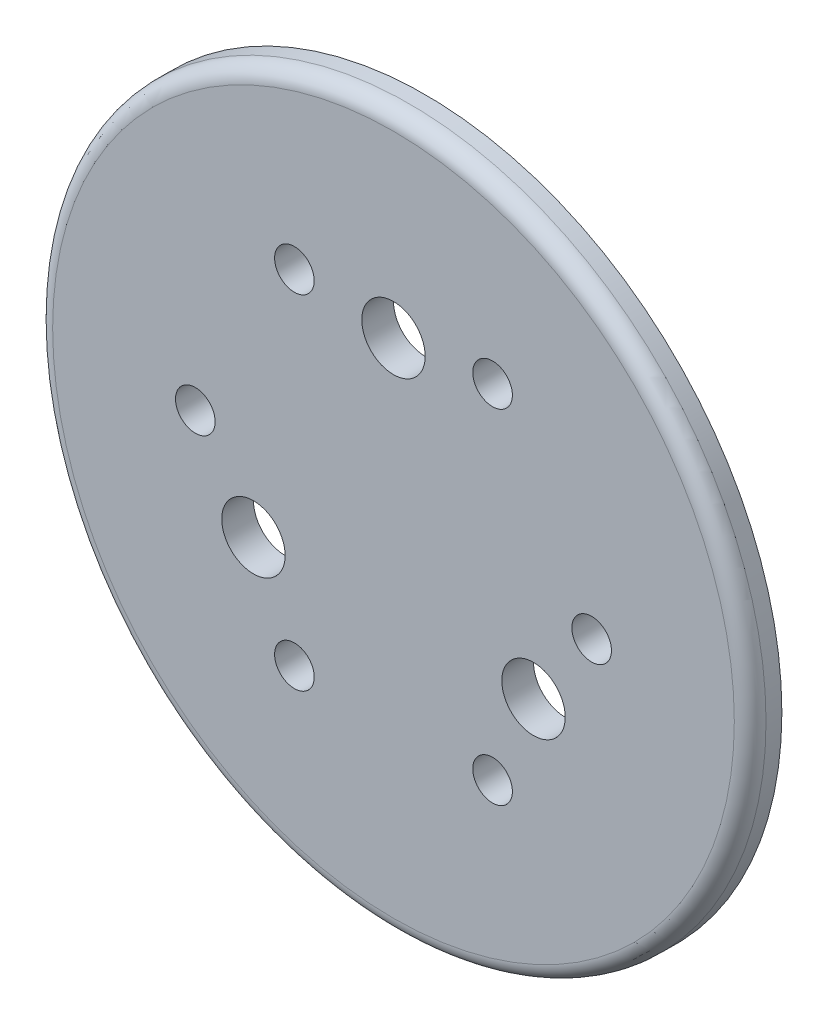
ISO-10303-21;
HEADER;
FILE_DESCRIPTION(('STEP AP214'),'2;1');
FILE_NAME('part.step','',(''),(''),'','','');
FILE_SCHEMA(('AUTOMOTIVE_DESIGN { 1 0 10303 214 1 1 1 1 }'));
ENDSEC;
DATA;
#1=APPLICATION_CONTEXT('core data for automotive mechanical design processes');
#2=APPLICATION_PROTOCOL_DEFINITION('international standard','automotive_design',2000,#1);
#3=PRODUCT_CONTEXT('',#1,'mechanical');
#4=PRODUCT('Part','Part','',(#3));
#5=PRODUCT_RELATED_PRODUCT_CATEGORY('part','',(#4));
#6=PRODUCT_DEFINITION_FORMATION('','',#4);
#7=PRODUCT_DEFINITION_CONTEXT('part definition',#1,'design');
#8=PRODUCT_DEFINITION('design','',#6,#7);
#9=PRODUCT_DEFINITION_SHAPE('','',#8);
#10=(LENGTH_UNIT() NAMED_UNIT(*) SI_UNIT(.MILLI.,.METRE.));
#11=(NAMED_UNIT(*) PLANE_ANGLE_UNIT() SI_UNIT($,.RADIAN.));
#12=(NAMED_UNIT(*) SI_UNIT($,.STERADIAN.) SOLID_ANGLE_UNIT());
#13=UNCERTAINTY_MEASURE_WITH_UNIT(LENGTH_MEASURE(1.E-05),#10,'distance_accuracy_value','');
#14=(GEOMETRIC_REPRESENTATION_CONTEXT(3) GLOBAL_UNCERTAINTY_ASSIGNED_CONTEXT((#13)) GLOBAL_UNIT_ASSIGNED_CONTEXT((#10,
#11,#12)) REPRESENTATION_CONTEXT('',''));
#15=CARTESIAN_POINT('',(0.,0.,0.));
#16=DIRECTION('',(0.,0.,1.));
#17=DIRECTION('',(1.,0.,0.));
#18=AXIS2_PLACEMENT_3D('',#15,#16,#17);
#19=CARTESIAN_POINT('',(0.,0.,-2.));
#20=DIRECTION('',(0.,0.,-1.));
#21=DIRECTION('',(1.,0.,0.));
#22=AXIS2_PLACEMENT_3D('',#19,#20,#21);
#23=PLANE('',#22);
#24=CARTESIAN_POINT('',(-8.83345911860132,-5.09999999999992,-2.));
#25=DIRECTION('',(0.,0.,1.));
#26=DIRECTION('',(1.,0.,0.));
#27=AXIS2_PLACEMENT_3D('',#24,#25,#26);
#28=CIRCLE('',#27,2.);
#29=CARTESIAN_POINT('',(-6.83345911860132,-5.09999999999992,-2.));
#30=VERTEX_POINT('',#29);
#31=EDGE_CURVE('E96',#30,#30,#28,.T.);
#32=ORIENTED_EDGE('',*,*,#31,.T.);
#33=EDGE_LOOP('',(#32));
#34=FACE_BOUND('',#33,.T.);
#35=CARTESIAN_POINT('',(-6.2500000000001,-10.8253175473054,-2.));
#36=DIRECTION('',(0.,0.,1.));
#37=DIRECTION('',(1.,0.,0.));
#38=AXIS2_PLACEMENT_3D('',#35,#36,#37);
#39=CIRCLE('',#38,1.25);
#40=CARTESIAN_POINT('',(-5.0000000000001,-10.8253175473054,-2.));
#41=VERTEX_POINT('',#40);
#42=EDGE_CURVE('E84',#41,#41,#39,.T.);
#43=ORIENTED_EDGE('',*,*,#42,.T.);
#44=EDGE_LOOP('',(#43));
#45=FACE_BOUND('',#44,.T.);
#46=CARTESIAN_POINT('',(12.5,0.,-2.));
#47=DIRECTION('',(0.,0.,1.));
#48=DIRECTION('',(1.,0.,0.));
#49=AXIS2_PLACEMENT_3D('',#46,#47,#48);
#50=CIRCLE('',#49,1.25);
#51=CARTESIAN_POINT('',(13.75,0.,-2.));
#52=VERTEX_POINT('',#51);
#53=EDGE_CURVE('E72',#52,#52,#50,.T.);
#54=ORIENTED_EDGE('',*,*,#53,.T.);
#55=EDGE_LOOP('',(#54));
#56=FACE_BOUND('',#55,.T.);
#57=CARTESIAN_POINT('',(-6.25000000000002,10.8253175473055,-2.));
#58=DIRECTION('',(0.,0.,1.));
#59=DIRECTION('',(1.,0.,0.));
#60=AXIS2_PLACEMENT_3D('',#57,#58,#59);
#61=CIRCLE('',#60,1.25);
#62=CARTESIAN_POINT('',(-5.00000000000002,10.8253175473055,-2.));
#63=VERTEX_POINT('',#62);
#64=EDGE_CURVE('E60',#63,#63,#61,.T.);
#65=ORIENTED_EDGE('',*,*,#64,.T.);
#66=EDGE_LOOP('',(#65));
#67=FACE_BOUND('',#66,.T.);
#68=CARTESIAN_POINT('',(0.,0.,-2.));
#69=DIRECTION('',(0.,0.,1.));
#70=DIRECTION('',(1.,0.,0.));
#71=AXIS2_PLACEMENT_3D('',#68,#69,#70);
#72=CIRCLE('',#71,22.5);
#73=CARTESIAN_POINT('',(22.5,0.,-2.));
#74=VERTEX_POINT('',#73);
#75=EDGE_CURVE('E50',#74,#74,#72,.T.);
#76=ORIENTED_EDGE('',*,*,#75,.F.);
#77=EDGE_LOOP('',(#76));
#78=FACE_BOUND('',#77,.T.);
#79=CARTESIAN_POINT('',(0.,10.2,-2.));
#80=DIRECTION('',(0.,0.,1.));
#81=DIRECTION('',(1.,0.,0.));
#82=AXIS2_PLACEMENT_3D('',#79,#80,#81);
#83=CIRCLE('',#82,2.);
#84=CARTESIAN_POINT('',(2.,10.2,-2.));
#85=VERTEX_POINT('',#84);
#86=EDGE_CURVE('E54',#85,#85,#83,.T.);
#87=ORIENTED_EDGE('',*,*,#86,.T.);
#88=EDGE_LOOP('',(#87));
#89=FACE_BOUND('',#88,.T.);
#90=CARTESIAN_POINT('',(6.25000000000002,10.8253175473055,-2.));
#91=DIRECTION('',(0.,0.,1.));
#92=DIRECTION('',(1.,0.,0.));
#93=AXIS2_PLACEMENT_3D('',#90,#91,#92);
#94=CIRCLE('',#93,1.25);
#95=CARTESIAN_POINT('',(7.50000000000002,10.8253175473055,-2.));
#96=VERTEX_POINT('',#95);
#97=EDGE_CURVE('E66',#96,#96,#94,.T.);
#98=ORIENTED_EDGE('',*,*,#97,.T.);
#99=EDGE_LOOP('',(#98));
#100=FACE_BOUND('',#99,.T.);
#101=CARTESIAN_POINT('',(6.24999999999993,-10.8253175473055,-2.));
#102=DIRECTION('',(0.,0.,1.));
#103=DIRECTION('',(1.,0.,0.));
#104=AXIS2_PLACEMENT_3D('',#101,#102,#103);
#105=CIRCLE('',#104,1.25);
#106=CARTESIAN_POINT('',(7.49999999999993,-10.8253175473055,-2.));
#107=VERTEX_POINT('',#106);
#108=EDGE_CURVE('E78',#107,#107,#105,.T.);
#109=ORIENTED_EDGE('',*,*,#108,.T.);
#110=EDGE_LOOP('',(#109));
#111=FACE_BOUND('',#110,.T.);
#112=CARTESIAN_POINT('',(-12.5,1.38083988687754E-13,-2.));
#113=DIRECTION('',(0.,0.,1.));
#114=DIRECTION('',(1.,0.,0.));
#115=AXIS2_PLACEMENT_3D('',#112,#113,#114);
#116=CIRCLE('',#115,1.25);
#117=CARTESIAN_POINT('',(-11.25,1.38083988687754E-13,-2.));
#118=VERTEX_POINT('',#117);
#119=EDGE_CURVE('E90',#118,#118,#116,.T.);
#120=ORIENTED_EDGE('',*,*,#119,.T.);
#121=EDGE_LOOP('',(#120));
#122=FACE_BOUND('',#121,.T.);
#123=CARTESIAN_POINT('',(8.83345911860125,-5.10000000000004,-2.));
#124=DIRECTION('',(0.,0.,1.));
#125=DIRECTION('',(1.,0.,0.));
#126=AXIS2_PLACEMENT_3D('',#123,#124,#125);
#127=CIRCLE('',#126,2.);
#128=CARTESIAN_POINT('',(10.8334591186013,-5.10000000000004,-2.));
#129=VERTEX_POINT('',#128);
#130=EDGE_CURVE('E102',#129,#129,#127,.T.);
#131=ORIENTED_EDGE('',*,*,#130,.T.);
#132=EDGE_LOOP('',(#131));
#133=FACE_BOUND('',#132,.T.);
#134=ADVANCED_FACE('F39',(#34,#45,#56,#67,#78,#89,#100,#111,#122,#133),#23,.T.);
#135=CARTESIAN_POINT('',(0.,0.,0.));
#136=DIRECTION('',(0.,0.,-1.));
#137=DIRECTION('',(1.,0.,0.));
#138=AXIS2_PLACEMENT_3D('',#135,#136,#137);
#139=PLANE('',#138);
#140=CARTESIAN_POINT('',(0.,0.,0.));
#141=DIRECTION('',(0.,0.,1.));
#142=DIRECTION('',(1.,0.,0.));
#143=AXIS2_PLACEMENT_3D('',#140,#141,#142);
#144=CIRCLE('',#143,21.5);
#145=CARTESIAN_POINT('',(21.5,0.,0.));
#146=VERTEX_POINT('',#145);
#147=EDGE_CURVE('E10',#146,#146,#144,.F.);
#148=ORIENTED_EDGE('',*,*,#147,.F.);
#149=EDGE_LOOP('',(#148));
#150=FACE_BOUND('',#149,.T.);
#151=CARTESIAN_POINT('',(0.,10.2,0.));
#152=DIRECTION('',(0.,0.,1.));
#153=DIRECTION('',(1.,0.,0.));
#154=AXIS2_PLACEMENT_3D('',#151,#152,#153);
#155=CIRCLE('',#154,2.);
#156=CARTESIAN_POINT('',(2.,10.2,0.));
#157=VERTEX_POINT('',#156);
#158=EDGE_CURVE('E57',#157,#157,#155,.T.);
#159=ORIENTED_EDGE('',*,*,#158,.F.);
#160=EDGE_LOOP('',(#159));
#161=FACE_BOUND('',#160,.T.);
#162=CARTESIAN_POINT('',(-6.25000000000002,10.8253175473055,0.));
#163=DIRECTION('',(0.,0.,1.));
#164=DIRECTION('',(1.,0.,0.));
#165=AXIS2_PLACEMENT_3D('',#162,#163,#164);
#166=CIRCLE('',#165,1.25);
#167=CARTESIAN_POINT('',(-5.00000000000002,10.8253175473055,0.));
#168=VERTEX_POINT('',#167);
#169=EDGE_CURVE('E63',#168,#168,#166,.T.);
#170=ORIENTED_EDGE('',*,*,#169,.F.);
#171=EDGE_LOOP('',(#170));
#172=FACE_BOUND('',#171,.T.);
#173=CARTESIAN_POINT('',(6.25000000000002,10.8253175473055,0.));
#174=DIRECTION('',(0.,0.,1.));
#175=DIRECTION('',(1.,0.,0.));
#176=AXIS2_PLACEMENT_3D('',#173,#174,#175);
#177=CIRCLE('',#176,1.25);
#178=CARTESIAN_POINT('',(7.50000000000002,10.8253175473055,0.));
#179=VERTEX_POINT('',#178);
#180=EDGE_CURVE('E69',#179,#179,#177,.T.);
#181=ORIENTED_EDGE('',*,*,#180,.F.);
#182=EDGE_LOOP('',(#181));
#183=FACE_BOUND('',#182,.T.);
#184=CARTESIAN_POINT('',(12.5,0.,0.));
#185=DIRECTION('',(0.,0.,1.));
#186=DIRECTION('',(1.,0.,0.));
#187=AXIS2_PLACEMENT_3D('',#184,#185,#186);
#188=CIRCLE('',#187,1.25);
#189=CARTESIAN_POINT('',(13.75,0.,0.));
#190=VERTEX_POINT('',#189);
#191=EDGE_CURVE('E75',#190,#190,#188,.T.);
#192=ORIENTED_EDGE('',*,*,#191,.F.);
#193=EDGE_LOOP('',(#192));
#194=FACE_BOUND('',#193,.T.);
#195=CARTESIAN_POINT('',(6.24999999999993,-10.8253175473055,0.));
#196=DIRECTION('',(0.,0.,1.));
#197=DIRECTION('',(1.,0.,0.));
#198=AXIS2_PLACEMENT_3D('',#195,#196,#197);
#199=CIRCLE('',#198,1.25);
#200=CARTESIAN_POINT('',(7.49999999999993,-10.8253175473055,0.));
#201=VERTEX_POINT('',#200);
#202=EDGE_CURVE('E81',#201,#201,#199,.T.);
#203=ORIENTED_EDGE('',*,*,#202,.F.);
#204=EDGE_LOOP('',(#203));
#205=FACE_BOUND('',#204,.T.);
#206=CARTESIAN_POINT('',(-6.2500000000001,-10.8253175473054,0.));
#207=DIRECTION('',(0.,0.,1.));
#208=DIRECTION('',(1.,0.,0.));
#209=AXIS2_PLACEMENT_3D('',#206,#207,#208);
#210=CIRCLE('',#209,1.25);
#211=CARTESIAN_POINT('',(-5.0000000000001,-10.8253175473054,0.));
#212=VERTEX_POINT('',#211);
#213=EDGE_CURVE('E87',#212,#212,#210,.T.);
#214=ORIENTED_EDGE('',*,*,#213,.F.);
#215=EDGE_LOOP('',(#214));
#216=FACE_BOUND('',#215,.T.);
#217=CARTESIAN_POINT('',(-12.5,1.38083988687754E-13,0.));
#218=DIRECTION('',(0.,0.,1.));
#219=DIRECTION('',(1.,0.,0.));
#220=AXIS2_PLACEMENT_3D('',#217,#218,#219);
#221=CIRCLE('',#220,1.25);
#222=CARTESIAN_POINT('',(-11.25,1.38083988687754E-13,0.));
#223=VERTEX_POINT('',#222);
#224=EDGE_CURVE('E93',#223,#223,#221,.T.);
#225=ORIENTED_EDGE('',*,*,#224,.F.);
#226=EDGE_LOOP('',(#225));
#227=FACE_BOUND('',#226,.T.);
#228=CARTESIAN_POINT('',(-8.83345911860132,-5.09999999999992,0.));
#229=DIRECTION('',(0.,0.,1.));
#230=DIRECTION('',(1.,0.,0.));
#231=AXIS2_PLACEMENT_3D('',#228,#229,#230);
#232=CIRCLE('',#231,2.);
#233=CARTESIAN_POINT('',(-6.83345911860132,-5.09999999999992,0.));
#234=VERTEX_POINT('',#233);
#235=EDGE_CURVE('E99',#234,#234,#232,.T.);
#236=ORIENTED_EDGE('',*,*,#235,.F.);
#237=EDGE_LOOP('',(#236));
#238=FACE_BOUND('',#237,.T.);
#239=CARTESIAN_POINT('',(8.83345911860125,-5.10000000000004,0.));
#240=DIRECTION('',(0.,0.,1.));
#241=DIRECTION('',(1.,0.,0.));
#242=AXIS2_PLACEMENT_3D('',#239,#240,#241);
#243=CIRCLE('',#242,2.);
#244=CARTESIAN_POINT('',(10.8334591186013,-5.10000000000004,0.));
#245=VERTEX_POINT('',#244);
#246=EDGE_CURVE('E105',#245,#245,#243,.T.);
#247=ORIENTED_EDGE('',*,*,#246,.F.);
#248=EDGE_LOOP('',(#247));
#249=FACE_BOUND('',#248,.T.);
#250=ADVANCED_FACE('F119',(#150,#161,#172,#183,#194,#205,#216,#227,#238,#249),#139,.F.);
#251=CARTESIAN_POINT('',(0.,0.,-2.));
#252=DIRECTION('',(0.,0.,1.));
#253=DIRECTION('',(-1.,0.,0.));
#254=AXIS2_PLACEMENT_3D('',#251,#252,#253);
#255=CYLINDRICAL_SURFACE('',#254,22.5);
#256=CARTESIAN_POINT('',(0.,0.,-1.));
#257=DIRECTION('',(0.,0.,1.));
#258=DIRECTION('',(1.,0.,0.));
#259=AXIS2_PLACEMENT_3D('',#256,#257,#258);
#260=CIRCLE('',#259,22.5);
#261=CARTESIAN_POINT('',(22.5,0.,-1.));
#262=VERTEX_POINT('',#261);
#263=EDGE_CURVE('E46',#262,#262,#260,.T.);
#264=ORIENTED_EDGE('',*,*,#263,.F.);
#265=EDGE_LOOP('',(#264));
#266=FACE_BOUND('',#265,.T.);
#267=ORIENTED_EDGE('',*,*,#75,.T.);
#268=EDGE_LOOP('',(#267));
#269=FACE_BOUND('',#268,.T.);
#270=ADVANCED_FACE('F121',(#266,#269),#255,.T.);
#271=CARTESIAN_POINT('',(0.,10.2,-2.));
#272=DIRECTION('',(0.,0.,1.));
#273=DIRECTION('',(-1.,0.,0.));
#274=AXIS2_PLACEMENT_3D('',#271,#272,#273);
#275=CYLINDRICAL_SURFACE('',#274,2.);
#276=ORIENTED_EDGE('',*,*,#86,.F.);
#277=EDGE_LOOP('',(#276));
#278=FACE_BOUND('',#277,.T.);
#279=ORIENTED_EDGE('',*,*,#158,.T.);
#280=EDGE_LOOP('',(#279));
#281=FACE_BOUND('',#280,.T.);
#282=ADVANCED_FACE('F128',(#278,#281),#275,.F.);
#283=CARTESIAN_POINT('',(-6.25000000000002,10.8253175473055,-2.));
#284=DIRECTION('',(0.,0.,1.));
#285=DIRECTION('',(-1.,0.,0.));
#286=AXIS2_PLACEMENT_3D('',#283,#284,#285);
#287=CYLINDRICAL_SURFACE('',#286,1.25);
#288=ORIENTED_EDGE('',*,*,#64,.F.);
#289=EDGE_LOOP('',(#288));
#290=FACE_BOUND('',#289,.T.);
#291=ORIENTED_EDGE('',*,*,#169,.T.);
#292=EDGE_LOOP('',(#291));
#293=FACE_BOUND('',#292,.T.);
#294=ADVANCED_FACE('F136',(#290,#293),#287,.F.);
#295=CARTESIAN_POINT('',(6.25000000000002,10.8253175473055,-2.));
#296=DIRECTION('',(0.,0.,1.));
#297=DIRECTION('',(-1.,0.,0.));
#298=AXIS2_PLACEMENT_3D('',#295,#296,#297);
#299=CYLINDRICAL_SURFACE('',#298,1.25);
#300=ORIENTED_EDGE('',*,*,#97,.F.);
#301=EDGE_LOOP('',(#300));
#302=FACE_BOUND('',#301,.T.);
#303=ORIENTED_EDGE('',*,*,#180,.T.);
#304=EDGE_LOOP('',(#303));
#305=FACE_BOUND('',#304,.T.);
#306=ADVANCED_FACE('F140',(#302,#305),#299,.F.);
#307=CARTESIAN_POINT('',(12.5,0.,-2.));
#308=DIRECTION('',(0.,0.,1.));
#309=DIRECTION('',(-1.,0.,0.));
#310=AXIS2_PLACEMENT_3D('',#307,#308,#309);
#311=CYLINDRICAL_SURFACE('',#310,1.25);
#312=ORIENTED_EDGE('',*,*,#53,.F.);
#313=EDGE_LOOP('',(#312));
#314=FACE_BOUND('',#313,.T.);
#315=ORIENTED_EDGE('',*,*,#191,.T.);
#316=EDGE_LOOP('',(#315));
#317=FACE_BOUND('',#316,.T.);
#318=ADVANCED_FACE('F144',(#314,#317),#311,.F.);
#319=CARTESIAN_POINT('',(6.24999999999993,-10.8253175473055,-2.));
#320=DIRECTION('',(0.,0.,1.));
#321=DIRECTION('',(-1.,0.,0.));
#322=AXIS2_PLACEMENT_3D('',#319,#320,#321);
#323=CYLINDRICAL_SURFACE('',#322,1.25);
#324=ORIENTED_EDGE('',*,*,#108,.F.);
#325=EDGE_LOOP('',(#324));
#326=FACE_BOUND('',#325,.T.);
#327=ORIENTED_EDGE('',*,*,#202,.T.);
#328=EDGE_LOOP('',(#327));
#329=FACE_BOUND('',#328,.T.);
#330=ADVANCED_FACE('F148',(#326,#329),#323,.F.);
#331=CARTESIAN_POINT('',(-6.2500000000001,-10.8253175473054,-2.));
#332=DIRECTION('',(0.,0.,1.));
#333=DIRECTION('',(-1.,0.,0.));
#334=AXIS2_PLACEMENT_3D('',#331,#332,#333);
#335=CYLINDRICAL_SURFACE('',#334,1.25);
#336=ORIENTED_EDGE('',*,*,#42,.F.);
#337=EDGE_LOOP('',(#336));
#338=FACE_BOUND('',#337,.T.);
#339=ORIENTED_EDGE('',*,*,#213,.T.);
#340=EDGE_LOOP('',(#339));
#341=FACE_BOUND('',#340,.T.);
#342=ADVANCED_FACE('F152',(#338,#341),#335,.F.);
#343=CARTESIAN_POINT('',(-12.5,1.38083988687754E-13,-2.));
#344=DIRECTION('',(0.,0.,1.));
#345=DIRECTION('',(-1.,0.,0.));
#346=AXIS2_PLACEMENT_3D('',#343,#344,#345);
#347=CYLINDRICAL_SURFACE('',#346,1.25);
#348=ORIENTED_EDGE('',*,*,#119,.F.);
#349=EDGE_LOOP('',(#348));
#350=FACE_BOUND('',#349,.T.);
#351=ORIENTED_EDGE('',*,*,#224,.T.);
#352=EDGE_LOOP('',(#351));
#353=FACE_BOUND('',#352,.T.);
#354=ADVANCED_FACE('F156',(#350,#353),#347,.F.);
#355=CARTESIAN_POINT('',(-8.83345911860132,-5.09999999999992,-2.));
#356=DIRECTION('',(0.,0.,1.));
#357=DIRECTION('',(-1.,0.,0.));
#358=AXIS2_PLACEMENT_3D('',#355,#356,#357);
#359=CYLINDRICAL_SURFACE('',#358,2.);
#360=ORIENTED_EDGE('',*,*,#31,.F.);
#361=EDGE_LOOP('',(#360));
#362=FACE_BOUND('',#361,.T.);
#363=ORIENTED_EDGE('',*,*,#235,.T.);
#364=EDGE_LOOP('',(#363));
#365=FACE_BOUND('',#364,.T.);
#366=ADVANCED_FACE('F115',(#362,#365),#359,.F.);
#367=CARTESIAN_POINT('',(8.83345911860125,-5.10000000000004,-2.));
#368=DIRECTION('',(0.,0.,1.));
#369=DIRECTION('',(-1.,0.,0.));
#370=AXIS2_PLACEMENT_3D('',#367,#368,#369);
#371=CYLINDRICAL_SURFACE('',#370,2.);
#372=ORIENTED_EDGE('',*,*,#130,.F.);
#373=EDGE_LOOP('',(#372));
#374=FACE_BOUND('',#373,.T.);
#375=ORIENTED_EDGE('',*,*,#246,.T.);
#376=EDGE_LOOP('',(#375));
#377=FACE_BOUND('',#376,.T.);
#378=ADVANCED_FACE('F112',(#374,#377),#371,.F.);
#379=CARTESIAN_POINT('',(0.,0.,-1.));
#380=DIRECTION('',(0.,0.,-1.));
#381=DIRECTION('',(1.,0.,0.));
#382=AXIS2_PLACEMENT_3D('',#379,#380,#381);
#383=TOROIDAL_SURFACE('',#382,21.5,1.);
#384=ORIENTED_EDGE('',*,*,#147,.T.);
#385=EDGE_LOOP('',(#384));
#386=FACE_BOUND('',#385,.T.);
#387=ORIENTED_EDGE('',*,*,#263,.T.);
#388=EDGE_LOOP('',(#387));
#389=FACE_BOUND('',#388,.T.);
#390=ADVANCED_FACE('F41',(#386,#389),#383,.T.);
#391=CLOSED_SHELL('',(#134,#250,#270,#282,#294,#306,#318,#330,#342,#354,#366,#378,#390));
#392=MANIFOLD_SOLID_BREP('B2',#391);
#393=ADVANCED_BREP_SHAPE_REPRESENTATION('',(#18,#392),#14);
#394=SHAPE_DEFINITION_REPRESENTATION(#9,#393);
ENDSEC;
END-ISO-10303-21;
